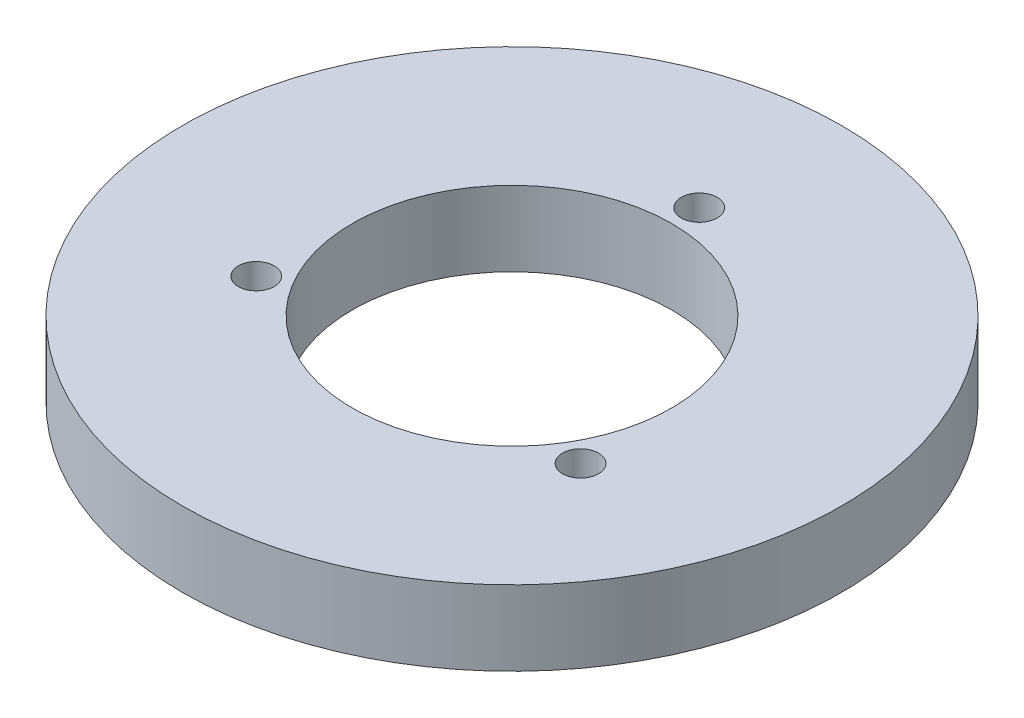
ISO-10303-21;
HEADER;
FILE_DESCRIPTION(('STEP AP214'),'2;1');
FILE_NAME('part.step','',(''),(''),'','','');
FILE_SCHEMA(('AUTOMOTIVE_DESIGN { 1 0 10303 214 1 1 1 1 }'));
ENDSEC;
DATA;
#1=APPLICATION_CONTEXT('core data for automotive mechanical design processes');
#2=APPLICATION_PROTOCOL_DEFINITION('international standard','automotive_design',2000,#1);
#3=PRODUCT_CONTEXT('',#1,'mechanical');
#4=PRODUCT('Part','Part','',(#3));
#5=PRODUCT_RELATED_PRODUCT_CATEGORY('part','',(#4));
#6=PRODUCT_DEFINITION_FORMATION('','',#4);
#7=PRODUCT_DEFINITION_CONTEXT('part definition',#1,'design');
#8=PRODUCT_DEFINITION('design','',#6,#7);
#9=PRODUCT_DEFINITION_SHAPE('','',#8);
#10=(LENGTH_UNIT() NAMED_UNIT(*) SI_UNIT(.MILLI.,.METRE.));
#11=(NAMED_UNIT(*) PLANE_ANGLE_UNIT() SI_UNIT($,.RADIAN.));
#12=(NAMED_UNIT(*) SI_UNIT($,.STERADIAN.) SOLID_ANGLE_UNIT());
#13=UNCERTAINTY_MEASURE_WITH_UNIT(LENGTH_MEASURE(1.E-05),#10,'distance_accuracy_value','');
#14=(GEOMETRIC_REPRESENTATION_CONTEXT(3) GLOBAL_UNCERTAINTY_ASSIGNED_CONTEXT((#13)) GLOBAL_UNIT_ASSIGNED_CONTEXT((#10,
#11,#12)) REPRESENTATION_CONTEXT('',''));
#15=CARTESIAN_POINT('',(0.,0.,0.));
#16=DIRECTION('',(0.,0.,1.));
#17=DIRECTION('',(1.,0.,0.));
#18=AXIS2_PLACEMENT_3D('',#15,#16,#17);
#19=CARTESIAN_POINT('',(0.,9.525,0.));
#20=DIRECTION('',(0.,1.,0.));
#21=DIRECTION('',(0.,0.,1.));
#22=AXIS2_PLACEMENT_3D('',#19,#20,#21);
#23=PLANE('',#22);
#24=CARTESIAN_POINT('',(0.,9.525,-23.8125));
#25=DIRECTION('',(0.,1.,0.));
#26=DIRECTION('',(0.,0.,1.));
#27=AXIS2_PLACEMENT_3D('',#24,#25,#26);
#28=CIRCLE('',#27,2.286);
#29=CARTESIAN_POINT('',(0.,9.525,-21.5265));
#30=VERTEX_POINT('',#29);
#31=EDGE_CURVE('E66',#30,#30,#28,.T.);
#32=ORIENTED_EDGE('',*,*,#31,.F.);
#33=EDGE_LOOP('',(#32));
#34=FACE_BOUND('',#33,.T.);
#35=CARTESIAN_POINT('',(20.6222299276185,9.525,11.9062499999991));
#36=DIRECTION('',(0.,1.,0.));
#37=DIRECTION('',(0.,0.,1.));
#38=AXIS2_PLACEMENT_3D('',#35,#36,#37);
#39=CIRCLE('',#38,2.286);
#40=CARTESIAN_POINT('',(20.6222299276185,9.525,14.1922499999991));
#41=VERTEX_POINT('',#40);
#42=EDGE_CURVE('E63',#41,#41,#39,.T.);
#43=ORIENTED_EDGE('',*,*,#42,.F.);
#44=EDGE_LOOP('',(#43));
#45=FACE_BOUND('',#44,.T.);
#46=CARTESIAN_POINT('',(-20.6222299276154,9.525,11.9062500000009));
#47=DIRECTION('',(0.,1.,0.));
#48=DIRECTION('',(0.,0.,1.));
#49=AXIS2_PLACEMENT_3D('',#46,#47,#48);
#50=CIRCLE('',#49,2.286);
#51=CARTESIAN_POINT('',(-20.6222299276154,9.525,14.1922500000009));
#52=VERTEX_POINT('',#51);
#53=EDGE_CURVE('E57',#52,#52,#50,.T.);
#54=ORIENTED_EDGE('',*,*,#53,.F.);
#55=EDGE_LOOP('',(#54));
#56=FACE_BOUND('',#55,.T.);
#57=CARTESIAN_POINT('',(0.,9.525,0.));
#58=DIRECTION('',(0.,1.,0.));
#59=DIRECTION('',(0.,0.,1.));
#60=AXIS2_PLACEMENT_3D('',#57,#58,#59);
#61=CIRCLE('',#60,41.91);
#62=CARTESIAN_POINT('',(0.,9.525,-41.91));
#63=VERTEX_POINT('',#62);
#64=EDGE_CURVE('E10',#63,#63,#61,.T.);
#65=ORIENTED_EDGE('',*,*,#64,.T.);
#66=EDGE_LOOP('',(#65));
#67=FACE_BOUND('',#66,.T.);
#68=CARTESIAN_POINT('',(0.,9.525,0.));
#69=DIRECTION('',(0.,1.,0.));
#70=DIRECTION('',(0.,0.,1.));
#71=AXIS2_PLACEMENT_3D('',#68,#69,#70);
#72=CIRCLE('',#71,20.32);
#73=CARTESIAN_POINT('',(0.,9.525,-20.32));
#74=VERTEX_POINT('',#73);
#75=EDGE_CURVE('E46',#74,#74,#72,.T.);
#76=ORIENTED_EDGE('',*,*,#75,.F.);
#77=EDGE_LOOP('',(#76));
#78=FACE_BOUND('',#77,.T.);
#79=ADVANCED_FACE('F35',(#34,#45,#56,#67,#78),#23,.T.);
#80=CARTESIAN_POINT('',(0.,0.,0.));
#81=DIRECTION('',(0.,1.,0.));
#82=DIRECTION('',(0.,0.,1.));
#83=AXIS2_PLACEMENT_3D('',#80,#81,#82);
#84=PLANE('',#83);
#85=CARTESIAN_POINT('',(0.,0.,-23.8125));
#86=DIRECTION('',(0.,1.,0.));
#87=DIRECTION('',(0.,0.,1.));
#88=AXIS2_PLACEMENT_3D('',#85,#86,#87);
#89=CIRCLE('',#88,2.286);
#90=CARTESIAN_POINT('',(0.,0.,-21.5265));
#91=VERTEX_POINT('',#90);
#92=EDGE_CURVE('E51',#91,#91,#89,.T.);
#93=ORIENTED_EDGE('',*,*,#92,.T.);
#94=EDGE_LOOP('',(#93));
#95=FACE_BOUND('',#94,.T.);
#96=CARTESIAN_POINT('',(20.6222299276185,0.,11.9062499999991));
#97=DIRECTION('',(0.,1.,0.));
#98=DIRECTION('',(0.,0.,1.));
#99=AXIS2_PLACEMENT_3D('',#96,#97,#98);
#100=CIRCLE('',#99,2.286);
#101=CARTESIAN_POINT('',(20.6222299276185,0.,14.1922499999991));
#102=VERTEX_POINT('',#101);
#103=EDGE_CURVE('E60',#102,#102,#100,.T.);
#104=ORIENTED_EDGE('',*,*,#103,.T.);
#105=EDGE_LOOP('',(#104));
#106=FACE_BOUND('',#105,.T.);
#107=CARTESIAN_POINT('',(-20.6222299276154,0.,11.9062500000009));
#108=DIRECTION('',(0.,1.,0.));
#109=DIRECTION('',(0.,0.,1.));
#110=AXIS2_PLACEMENT_3D('',#107,#108,#109);
#111=CIRCLE('',#110,2.286);
#112=CARTESIAN_POINT('',(-20.6222299276154,0.,14.1922500000009));
#113=VERTEX_POINT('',#112);
#114=EDGE_CURVE('E54',#113,#113,#111,.T.);
#115=ORIENTED_EDGE('',*,*,#114,.T.);
#116=EDGE_LOOP('',(#115));
#117=FACE_BOUND('',#116,.T.);
#118=CARTESIAN_POINT('',(0.,0.,0.));
#119=DIRECTION('',(0.,1.,0.));
#120=DIRECTION('',(0.,0.,1.));
#121=AXIS2_PLACEMENT_3D('',#118,#119,#120);
#122=CIRCLE('',#121,41.91);
#123=CARTESIAN_POINT('',(0.,0.,-41.91));
#124=VERTEX_POINT('',#123);
#125=EDGE_CURVE('E39',#124,#124,#122,.T.);
#126=ORIENTED_EDGE('',*,*,#125,.F.);
#127=EDGE_LOOP('',(#126));
#128=FACE_BOUND('',#127,.T.);
#129=CARTESIAN_POINT('',(0.,0.,0.));
#130=DIRECTION('',(0.,1.,0.));
#131=DIRECTION('',(0.,0.,1.));
#132=AXIS2_PLACEMENT_3D('',#129,#130,#131);
#133=CIRCLE('',#132,20.32);
#134=CARTESIAN_POINT('',(0.,0.,-20.32));
#135=VERTEX_POINT('',#134);
#136=EDGE_CURVE('E48',#135,#135,#133,.T.);
#137=ORIENTED_EDGE('',*,*,#136,.T.);
#138=EDGE_LOOP('',(#137));
#139=FACE_BOUND('',#138,.T.);
#140=ADVANCED_FACE('F72',(#95,#106,#117,#128,#139),#84,.F.);
#141=CARTESIAN_POINT('',(0.,9.525,0.));
#142=DIRECTION('',(0.,-1.,0.));
#143=DIRECTION('',(0.,0.,-1.));
#144=AXIS2_PLACEMENT_3D('',#141,#142,#143);
#145=CYLINDRICAL_SURFACE('',#144,41.91);
#146=CARTESIAN_POINT('',(0.,9.525,-41.91));
#147=CARTESIAN_POINT('',(0.,9.42578125,-41.91));
#148=CARTESIAN_POINT('',(0.,9.3265625,-41.91));
#149=CARTESIAN_POINT('',(0.,9.128125,-41.91));
#150=CARTESIAN_POINT('',(0.,9.02890625,-41.91));
#151=CARTESIAN_POINT('',(0.,8.83046875,-41.91));
#152=CARTESIAN_POINT('',(0.,8.73125,-41.91));
#153=CARTESIAN_POINT('',(0.,8.5328125,-41.91));
#154=CARTESIAN_POINT('',(0.,8.43359375,-41.91));
#155=CARTESIAN_POINT('',(0.,8.23515625,-41.91));
#156=CARTESIAN_POINT('',(0.,8.1359375,-41.91));
#157=CARTESIAN_POINT('',(0.,7.9375,-41.91));
#158=CARTESIAN_POINT('',(0.,7.83828125,-41.91));
#159=CARTESIAN_POINT('',(0.,7.63984375,-41.91));
#160=CARTESIAN_POINT('',(0.,7.540625,-41.91));
#161=CARTESIAN_POINT('',(0.,7.3421875,-41.91));
#162=CARTESIAN_POINT('',(0.,7.24296875,-41.91));
#163=CARTESIAN_POINT('',(0.,7.04453125,-41.91));
#164=CARTESIAN_POINT('',(0.,6.9453125,-41.91));
#165=CARTESIAN_POINT('',(0.,6.746875,-41.91));
#166=CARTESIAN_POINT('',(0.,6.64765625,-41.91));
#167=CARTESIAN_POINT('',(0.,6.44921875,-41.91));
#168=CARTESIAN_POINT('',(0.,6.35,-41.91));
#169=CARTESIAN_POINT('',(0.,6.1515625,-41.91));
#170=CARTESIAN_POINT('',(0.,6.05234375,-41.91));
#171=CARTESIAN_POINT('',(0.,5.85390625,-41.91));
#172=CARTESIAN_POINT('',(0.,5.7546875,-41.91));
#173=CARTESIAN_POINT('',(0.,5.55625,-41.91));
#174=CARTESIAN_POINT('',(0.,5.45703125,-41.91));
#175=CARTESIAN_POINT('',(0.,5.25859375,-41.91));
#176=CARTESIAN_POINT('',(0.,5.159375,-41.91));
#177=CARTESIAN_POINT('',(0.,4.9609375,-41.91));
#178=CARTESIAN_POINT('',(0.,4.86171875,-41.91));
#179=CARTESIAN_POINT('',(0.,4.66328125,-41.91));
#180=CARTESIAN_POINT('',(0.,4.5640625,-41.91));
#181=CARTESIAN_POINT('',(0.,4.365625,-41.91));
#182=CARTESIAN_POINT('',(0.,4.26640625,-41.91));
#183=CARTESIAN_POINT('',(0.,4.06796875,-41.91));
#184=CARTESIAN_POINT('',(0.,3.96875,-41.91));
#185=CARTESIAN_POINT('',(0.,3.7703125,-41.91));
#186=CARTESIAN_POINT('',(0.,3.67109375,-41.91));
#187=CARTESIAN_POINT('',(0.,3.47265625,-41.91));
#188=CARTESIAN_POINT('',(0.,3.3734375,-41.91));
#189=CARTESIAN_POINT('',(0.,3.175,-41.91));
#190=CARTESIAN_POINT('',(0.,3.07578125,-41.91));
#191=CARTESIAN_POINT('',(0.,2.87734375,-41.91));
#192=CARTESIAN_POINT('',(0.,2.778125,-41.91));
#193=CARTESIAN_POINT('',(0.,2.5796875,-41.91));
#194=CARTESIAN_POINT('',(0.,2.48046875,-41.91));
#195=CARTESIAN_POINT('',(0.,2.28203125,-41.91));
#196=CARTESIAN_POINT('',(0.,2.1828125,-41.91));
#197=CARTESIAN_POINT('',(0.,1.984375,-41.91));
#198=CARTESIAN_POINT('',(0.,1.88515625,-41.91));
#199=CARTESIAN_POINT('',(0.,1.68671875,-41.91));
#200=CARTESIAN_POINT('',(0.,1.5875,-41.91));
#201=CARTESIAN_POINT('',(0.,1.3890625,-41.91));
#202=CARTESIAN_POINT('',(0.,1.28984375,-41.91));
#203=CARTESIAN_POINT('',(0.,1.09140625,-41.91));
#204=CARTESIAN_POINT('',(0.,0.992187500000001,-41.91));
#205=CARTESIAN_POINT('',(0.,0.793750000000001,-41.91));
#206=CARTESIAN_POINT('',(0.,0.69453125,-41.91));
#207=CARTESIAN_POINT('',(0.,0.49609375,-41.91));
#208=CARTESIAN_POINT('',(0.,0.396875,-41.91));
#209=CARTESIAN_POINT('',(0.,0.1984375,-41.91));
#210=CARTESIAN_POINT('',(0.,0.0992187500000001,-41.91));
#211=CARTESIAN_POINT('',(0.,0.,-41.91));
#212=B_SPLINE_CURVE_WITH_KNOTS('',3,(#146,#147,#148,#149,#150,#151,#152,#153,#154,#155,#156,
#157,#158,#159,#160,#161,#162,#163,#164,#165,#166,#167,#168,#169,#170,#171,#172,#173,#174,#175,
#176,#177,#178,#179,#180,#181,#182,#183,#184,#185,#186,#187,#188,#189,#190,#191,#192,#193,#194,
#195,#196,#197,#198,#199,#200,#201,#202,#203,#204,#205,#206,#207,#208,#209,#210,#211),
.UNSPECIFIED.,.F.,.F.,(4,2,2,2,2,2,2,2,2,2,2,2,2,2,2,2,2,2,2,2,2,2,2,2,2,2,2,2,2,2,2,2,4),(0.,
0.29765625,0.5953125,0.892968750000001,1.190625,1.48828125,1.7859375,2.08359375,2.38125,
2.67890625,2.9765625,3.27421875,3.571875,3.86953125,4.1671875,4.46484375,4.7625,5.06015625,
5.3578125,5.65546875,5.953125,6.25078125,6.5484375,6.84609375,7.14375,7.44140625,7.7390625,
8.03671875,8.334375,8.63203125,8.9296875,9.22734375,9.525),.UNSPECIFIED.);
#213=EDGE_CURVE('BSEAM37',#63,#124,#212,.T.);
#214=ORIENTED_EDGE('',*,*,#64,.F.);
#215=ORIENTED_EDGE('',*,*,#125,.T.);
#216=ORIENTED_EDGE('',*,*,#213,.T.);
#217=ORIENTED_EDGE('',*,*,#213,.F.);
#218=EDGE_LOOP('',(#214,#216,#215,#217));
#219=FACE_BOUND('',#218,.T.);
#220=ADVANCED_FACE('F37',(#219),#145,.T.);
#221=CARTESIAN_POINT('',(0.,9.525,0.));
#222=DIRECTION('',(0.,-1.,0.));
#223=DIRECTION('',(0.,0.,-1.));
#224=AXIS2_PLACEMENT_3D('',#221,#222,#223);
#225=CYLINDRICAL_SURFACE('',#224,20.32);
#226=CARTESIAN_POINT('',(0.,9.525,-20.32));
#227=CARTESIAN_POINT('',(0.,9.42578125,-20.32));
#228=CARTESIAN_POINT('',(0.,9.3265625,-20.32));
#229=CARTESIAN_POINT('',(0.,9.128125,-20.32));
#230=CARTESIAN_POINT('',(0.,9.02890625,-20.32));
#231=CARTESIAN_POINT('',(0.,8.83046875,-20.32));
#232=CARTESIAN_POINT('',(0.,8.73125,-20.32));
#233=CARTESIAN_POINT('',(0.,8.5328125,-20.32));
#234=CARTESIAN_POINT('',(0.,8.43359375,-20.32));
#235=CARTESIAN_POINT('',(0.,8.23515625,-20.32));
#236=CARTESIAN_POINT('',(0.,8.1359375,-20.32));
#237=CARTESIAN_POINT('',(0.,7.9375,-20.32));
#238=CARTESIAN_POINT('',(0.,7.83828125,-20.32));
#239=CARTESIAN_POINT('',(0.,7.63984375,-20.32));
#240=CARTESIAN_POINT('',(0.,7.540625,-20.32));
#241=CARTESIAN_POINT('',(0.,7.3421875,-20.32));
#242=CARTESIAN_POINT('',(0.,7.24296875,-20.32));
#243=CARTESIAN_POINT('',(0.,7.04453125,-20.32));
#244=CARTESIAN_POINT('',(0.,6.9453125,-20.32));
#245=CARTESIAN_POINT('',(0.,6.746875,-20.32));
#246=CARTESIAN_POINT('',(0.,6.64765625,-20.32));
#247=CARTESIAN_POINT('',(0.,6.44921875,-20.32));
#248=CARTESIAN_POINT('',(0.,6.35,-20.32));
#249=CARTESIAN_POINT('',(0.,6.1515625,-20.32));
#250=CARTESIAN_POINT('',(0.,6.05234375,-20.32));
#251=CARTESIAN_POINT('',(0.,5.85390625,-20.32));
#252=CARTESIAN_POINT('',(0.,5.7546875,-20.32));
#253=CARTESIAN_POINT('',(0.,5.55625,-20.32));
#254=CARTESIAN_POINT('',(0.,5.45703125,-20.32));
#255=CARTESIAN_POINT('',(0.,5.25859375,-20.32));
#256=CARTESIAN_POINT('',(0.,5.159375,-20.32));
#257=CARTESIAN_POINT('',(0.,4.9609375,-20.32));
#258=CARTESIAN_POINT('',(0.,4.86171875,-20.32));
#259=CARTESIAN_POINT('',(0.,4.66328125,-20.32));
#260=CARTESIAN_POINT('',(0.,4.5640625,-20.32));
#261=CARTESIAN_POINT('',(0.,4.365625,-20.32));
#262=CARTESIAN_POINT('',(0.,4.26640625,-20.32));
#263=CARTESIAN_POINT('',(0.,4.06796875,-20.32));
#264=CARTESIAN_POINT('',(0.,3.96875,-20.32));
#265=CARTESIAN_POINT('',(0.,3.7703125,-20.32));
#266=CARTESIAN_POINT('',(0.,3.67109375,-20.32));
#267=CARTESIAN_POINT('',(0.,3.47265625,-20.32));
#268=CARTESIAN_POINT('',(0.,3.3734375,-20.32));
#269=CARTESIAN_POINT('',(0.,3.175,-20.32));
#270=CARTESIAN_POINT('',(0.,3.07578125,-20.32));
#271=CARTESIAN_POINT('',(0.,2.87734375,-20.32));
#272=CARTESIAN_POINT('',(0.,2.778125,-20.32));
#273=CARTESIAN_POINT('',(0.,2.5796875,-20.32));
#274=CARTESIAN_POINT('',(0.,2.48046875,-20.32));
#275=CARTESIAN_POINT('',(0.,2.28203125,-20.32));
#276=CARTESIAN_POINT('',(0.,2.1828125,-20.32));
#277=CARTESIAN_POINT('',(0.,1.984375,-20.32));
#278=CARTESIAN_POINT('',(0.,1.88515625,-20.32));
#279=CARTESIAN_POINT('',(0.,1.68671875,-20.32));
#280=CARTESIAN_POINT('',(0.,1.5875,-20.32));
#281=CARTESIAN_POINT('',(0.,1.3890625,-20.32));
#282=CARTESIAN_POINT('',(0.,1.28984375,-20.32));
#283=CARTESIAN_POINT('',(0.,1.09140625,-20.32));
#284=CARTESIAN_POINT('',(0.,0.992187500000001,-20.32));
#285=CARTESIAN_POINT('',(0.,0.793750000000001,-20.32));
#286=CARTESIAN_POINT('',(0.,0.69453125,-20.32));
#287=CARTESIAN_POINT('',(0.,0.49609375,-20.32));
#288=CARTESIAN_POINT('',(0.,0.396875,-20.32));
#289=CARTESIAN_POINT('',(0.,0.1984375,-20.32));
#290=CARTESIAN_POINT('',(0.,0.0992187500000001,-20.32));
#291=CARTESIAN_POINT('',(0.,0.,-20.32));
#292=B_SPLINE_CURVE_WITH_KNOTS('',3,(#226,#227,#228,#229,#230,#231,#232,#233,#234,#235,#236,
#237,#238,#239,#240,#241,#242,#243,#244,#245,#246,#247,#248,#249,#250,#251,#252,#253,#254,#255,
#256,#257,#258,#259,#260,#261,#262,#263,#264,#265,#266,#267,#268,#269,#270,#271,#272,#273,#274,
#275,#276,#277,#278,#279,#280,#281,#282,#283,#284,#285,#286,#287,#288,#289,#290,#291),
.UNSPECIFIED.,.F.,.F.,(4,2,2,2,2,2,2,2,2,2,2,2,2,2,2,2,2,2,2,2,2,2,2,2,2,2,2,2,2,2,2,2,4),(0.,
0.297656249999998,0.595312499999999,0.892968749999999,1.190625,1.48828125,1.7859375,2.08359375,
2.38125,2.67890625,2.9765625,3.27421875,3.571875,3.86953125,4.1671875,4.46484375,4.7625,
5.06015625,5.3578125,5.65546875,5.953125,6.25078125,6.5484375,6.84609375,7.14375,7.44140625,
7.7390625,8.03671875,8.334375,8.63203125,8.9296875,9.22734375,9.525),.UNSPECIFIED.);
#293=EDGE_CURVE('BSEAM91',#74,#135,#292,.T.);
#294=ORIENTED_EDGE('',*,*,#75,.T.);
#295=ORIENTED_EDGE('',*,*,#136,.F.);
#296=ORIENTED_EDGE('',*,*,#293,.T.);
#297=ORIENTED_EDGE('',*,*,#293,.F.);
#298=EDGE_LOOP('',(#294,#296,#295,#297));
#299=FACE_BOUND('',#298,.T.);
#300=ADVANCED_FACE('F91',(#299),#225,.F.);
#301=CARTESIAN_POINT('',(-20.6222299276154,0.,11.9062500000009));
#302=DIRECTION('',(0.,1.,0.));
#303=DIRECTION('',(0.,0.,1.));
#304=AXIS2_PLACEMENT_3D('',#301,#302,#303);
#305=CYLINDRICAL_SURFACE('',#304,2.286);
#306=CARTESIAN_POINT('',(-20.6222299276154,0.,14.1922500000009));
#307=CARTESIAN_POINT('',(-20.6222299276154,0.0992187499999999,14.1922500000009));
#308=CARTESIAN_POINT('',(-20.6222299276154,0.1984375,14.1922500000009));
#309=CARTESIAN_POINT('',(-20.6222299276154,0.396875,14.1922500000009));
#310=CARTESIAN_POINT('',(-20.6222299276154,0.49609375,14.1922500000009));
#311=CARTESIAN_POINT('',(-20.6222299276154,0.69453125,14.1922500000009));
#312=CARTESIAN_POINT('',(-20.6222299276154,0.79375,14.1922500000009));
#313=CARTESIAN_POINT('',(-20.6222299276154,0.9921875,14.1922500000009));
#314=CARTESIAN_POINT('',(-20.6222299276154,1.09140625,14.1922500000009));
#315=CARTESIAN_POINT('',(-20.6222299276154,1.28984375,14.1922500000009));
#316=CARTESIAN_POINT('',(-20.6222299276154,1.3890625,14.1922500000009));
#317=CARTESIAN_POINT('',(-20.6222299276154,1.5875,14.1922500000009));
#318=CARTESIAN_POINT('',(-20.6222299276154,1.68671875,14.1922500000009));
#319=CARTESIAN_POINT('',(-20.6222299276154,1.88515625,14.1922500000009));
#320=CARTESIAN_POINT('',(-20.6222299276154,1.984375,14.1922500000009));
#321=CARTESIAN_POINT('',(-20.6222299276154,2.1828125,14.1922500000009));
#322=CARTESIAN_POINT('',(-20.6222299276154,2.28203125,14.1922500000009));
#323=CARTESIAN_POINT('',(-20.6222299276154,2.48046875,14.1922500000009));
#324=CARTESIAN_POINT('',(-20.6222299276154,2.5796875,14.1922500000009));
#325=CARTESIAN_POINT('',(-20.6222299276154,2.778125,14.1922500000009));
#326=CARTESIAN_POINT('',(-20.6222299276154,2.87734375,14.1922500000009));
#327=CARTESIAN_POINT('',(-20.6222299276154,3.07578125,14.1922500000009));
#328=CARTESIAN_POINT('',(-20.6222299276154,3.175,14.1922500000009));
#329=CARTESIAN_POINT('',(-20.6222299276154,3.3734375,14.1922500000009));
#330=CARTESIAN_POINT('',(-20.6222299276154,3.47265625,14.1922500000009));
#331=CARTESIAN_POINT('',(-20.6222299276154,3.67109375,14.1922500000009));
#332=CARTESIAN_POINT('',(-20.6222299276154,3.7703125,14.1922500000009));
#333=CARTESIAN_POINT('',(-20.6222299276154,3.96875,14.1922500000009));
#334=CARTESIAN_POINT('',(-20.6222299276154,4.06796875,14.1922500000009));
#335=CARTESIAN_POINT('',(-20.6222299276154,4.26640625,14.1922500000009));
#336=CARTESIAN_POINT('',(-20.6222299276154,4.365625,14.1922500000009));
#337=CARTESIAN_POINT('',(-20.6222299276154,4.5640625,14.1922500000009));
#338=CARTESIAN_POINT('',(-20.6222299276154,4.66328125,14.1922500000009));
#339=CARTESIAN_POINT('',(-20.6222299276154,4.86171875,14.1922500000009));
#340=CARTESIAN_POINT('',(-20.6222299276154,4.9609375,14.1922500000009));
#341=CARTESIAN_POINT('',(-20.6222299276154,5.159375,14.1922500000009));
#342=CARTESIAN_POINT('',(-20.6222299276154,5.25859375,14.1922500000009));
#343=CARTESIAN_POINT('',(-20.6222299276154,5.45703125,14.1922500000009));
#344=CARTESIAN_POINT('',(-20.6222299276154,5.55625,14.1922500000009));
#345=CARTESIAN_POINT('',(-20.6222299276154,5.7546875,14.1922500000009));
#346=CARTESIAN_POINT('',(-20.6222299276154,5.85390625,14.1922500000009));
#347=CARTESIAN_POINT('',(-20.6222299276154,6.05234375,14.1922500000009));
#348=CARTESIAN_POINT('',(-20.6222299276154,6.1515625,14.1922500000009));
#349=CARTESIAN_POINT('',(-20.6222299276154,6.35,14.1922500000009));
#350=CARTESIAN_POINT('',(-20.6222299276154,6.44921875,14.1922500000009));
#351=CARTESIAN_POINT('',(-20.6222299276154,6.64765625,14.1922500000009));
#352=CARTESIAN_POINT('',(-20.6222299276154,6.746875,14.1922500000009));
#353=CARTESIAN_POINT('',(-20.6222299276154,6.9453125,14.1922500000009));
#354=CARTESIAN_POINT('',(-20.6222299276154,7.04453125,14.1922500000009));
#355=CARTESIAN_POINT('',(-20.6222299276154,7.24296875,14.1922500000009));
#356=CARTESIAN_POINT('',(-20.6222299276154,7.3421875,14.1922500000009));
#357=CARTESIAN_POINT('',(-20.6222299276154,7.540625,14.1922500000009));
#358=CARTESIAN_POINT('',(-20.6222299276154,7.63984375,14.1922500000009));
#359=CARTESIAN_POINT('',(-20.6222299276154,7.83828125,14.1922500000009));
#360=CARTESIAN_POINT('',(-20.6222299276154,7.9375,14.1922500000009));
#361=CARTESIAN_POINT('',(-20.6222299276154,8.1359375,14.1922500000009));
#362=CARTESIAN_POINT('',(-20.6222299276154,8.23515625,14.1922500000009));
#363=CARTESIAN_POINT('',(-20.6222299276154,8.43359375,14.1922500000009));
#364=CARTESIAN_POINT('',(-20.6222299276154,8.5328125,14.1922500000009));
#365=CARTESIAN_POINT('',(-20.6222299276154,8.73125,14.1922500000009));
#366=CARTESIAN_POINT('',(-20.6222299276154,8.83046875,14.1922500000009));
#367=CARTESIAN_POINT('',(-20.6222299276154,9.02890625,14.1922500000009));
#368=CARTESIAN_POINT('',(-20.6222299276154,9.128125,14.1922500000009));
#369=CARTESIAN_POINT('',(-20.6222299276154,9.3265625,14.1922500000009));
#370=CARTESIAN_POINT('',(-20.6222299276154,9.42578125,14.1922500000009));
#371=CARTESIAN_POINT('',(-20.6222299276154,9.525,14.1922500000009));
#372=B_SPLINE_CURVE_WITH_KNOTS('',3,(#306,#307,#308,#309,#310,#311,#312,#313,#314,#315,#316,
#317,#318,#319,#320,#321,#322,#323,#324,#325,#326,#327,#328,#329,#330,#331,#332,#333,#334,#335,
#336,#337,#338,#339,#340,#341,#342,#343,#344,#345,#346,#347,#348,#349,#350,#351,#352,#353,#354,
#355,#356,#357,#358,#359,#360,#361,#362,#363,#364,#365,#366,#367,#368,#369,#370,#371),
.UNSPECIFIED.,.F.,.F.,(4,2,2,2,2,2,2,2,2,2,2,2,2,2,2,2,2,2,2,2,2,2,2,2,2,2,2,2,2,2,2,2,4),(0.,
0.29765625,0.5953125,0.89296875,1.190625,1.48828125,1.7859375,2.08359375,2.38125,2.67890625,
2.9765625,3.27421875,3.571875,3.86953125,4.1671875,4.46484375,4.7625,5.06015625,5.3578125,
5.65546875,5.953125,6.25078125,6.5484375,6.84609375,7.14375,7.44140625,7.7390625,8.03671875,
8.334375,8.63203125,8.9296875,9.22734375,9.525),.UNSPECIFIED.);
#373=EDGE_CURVE('BSEAM94',#113,#52,#372,.T.);
#374=ORIENTED_EDGE('',*,*,#114,.F.);
#375=ORIENTED_EDGE('',*,*,#53,.T.);
#376=ORIENTED_EDGE('',*,*,#373,.T.);
#377=ORIENTED_EDGE('',*,*,#373,.F.);
#378=EDGE_LOOP('',(#374,#376,#375,#377));
#379=FACE_BOUND('',#378,.T.);
#380=ADVANCED_FACE('F94',(#379),#305,.F.);
#381=CARTESIAN_POINT('',(20.6222299276185,0.,11.9062499999991));
#382=DIRECTION('',(0.,1.,0.));
#383=DIRECTION('',(0.,0.,1.));
#384=AXIS2_PLACEMENT_3D('',#381,#382,#383);
#385=CYLINDRICAL_SURFACE('',#384,2.286);
#386=CARTESIAN_POINT('',(20.6222299276185,0.,14.1922499999991));
#387=CARTESIAN_POINT('',(20.6222299276185,0.0992187499999999,14.1922499999991));
#388=CARTESIAN_POINT('',(20.6222299276185,0.1984375,14.1922499999991));
#389=CARTESIAN_POINT('',(20.6222299276185,0.396875,14.1922499999991));
#390=CARTESIAN_POINT('',(20.6222299276185,0.49609375,14.1922499999991));
#391=CARTESIAN_POINT('',(20.6222299276185,0.69453125,14.1922499999991));
#392=CARTESIAN_POINT('',(20.6222299276185,0.79375,14.1922499999991));
#393=CARTESIAN_POINT('',(20.6222299276185,0.9921875,14.1922499999991));
#394=CARTESIAN_POINT('',(20.6222299276185,1.09140625,14.1922499999991));
#395=CARTESIAN_POINT('',(20.6222299276185,1.28984375,14.1922499999991));
#396=CARTESIAN_POINT('',(20.6222299276185,1.3890625,14.1922499999991));
#397=CARTESIAN_POINT('',(20.6222299276185,1.5875,14.1922499999991));
#398=CARTESIAN_POINT('',(20.6222299276185,1.68671875,14.1922499999991));
#399=CARTESIAN_POINT('',(20.6222299276185,1.88515625,14.1922499999991));
#400=CARTESIAN_POINT('',(20.6222299276185,1.984375,14.1922499999991));
#401=CARTESIAN_POINT('',(20.6222299276185,2.1828125,14.1922499999991));
#402=CARTESIAN_POINT('',(20.6222299276185,2.28203125,14.1922499999991));
#403=CARTESIAN_POINT('',(20.6222299276185,2.48046875,14.1922499999991));
#404=CARTESIAN_POINT('',(20.6222299276185,2.5796875,14.1922499999991));
#405=CARTESIAN_POINT('',(20.6222299276185,2.778125,14.1922499999991));
#406=CARTESIAN_POINT('',(20.6222299276185,2.87734375,14.1922499999991));
#407=CARTESIAN_POINT('',(20.6222299276185,3.07578125,14.1922499999991));
#408=CARTESIAN_POINT('',(20.6222299276185,3.175,14.1922499999991));
#409=CARTESIAN_POINT('',(20.6222299276185,3.3734375,14.1922499999991));
#410=CARTESIAN_POINT('',(20.6222299276185,3.47265625,14.1922499999991));
#411=CARTESIAN_POINT('',(20.6222299276185,3.67109375,14.1922499999991));
#412=CARTESIAN_POINT('',(20.6222299276185,3.7703125,14.1922499999991));
#413=CARTESIAN_POINT('',(20.6222299276185,3.96875,14.1922499999991));
#414=CARTESIAN_POINT('',(20.6222299276185,4.06796875,14.1922499999991));
#415=CARTESIAN_POINT('',(20.6222299276185,4.26640625,14.1922499999991));
#416=CARTESIAN_POINT('',(20.6222299276185,4.365625,14.1922499999991));
#417=CARTESIAN_POINT('',(20.6222299276185,4.5640625,14.1922499999991));
#418=CARTESIAN_POINT('',(20.6222299276185,4.66328125,14.1922499999991));
#419=CARTESIAN_POINT('',(20.6222299276185,4.86171875,14.1922499999991));
#420=CARTESIAN_POINT('',(20.6222299276185,4.9609375,14.1922499999991));
#421=CARTESIAN_POINT('',(20.6222299276185,5.159375,14.1922499999991));
#422=CARTESIAN_POINT('',(20.6222299276185,5.25859375,14.1922499999991));
#423=CARTESIAN_POINT('',(20.6222299276185,5.45703125,14.1922499999991));
#424=CARTESIAN_POINT('',(20.6222299276185,5.55625,14.1922499999991));
#425=CARTESIAN_POINT('',(20.6222299276185,5.7546875,14.1922499999991));
#426=CARTESIAN_POINT('',(20.6222299276185,5.85390625,14.1922499999991));
#427=CARTESIAN_POINT('',(20.6222299276185,6.05234375,14.1922499999991));
#428=CARTESIAN_POINT('',(20.6222299276185,6.1515625,14.1922499999991));
#429=CARTESIAN_POINT('',(20.6222299276185,6.35,14.1922499999991));
#430=CARTESIAN_POINT('',(20.6222299276185,6.44921875,14.1922499999991));
#431=CARTESIAN_POINT('',(20.6222299276185,6.64765625,14.1922499999991));
#432=CARTESIAN_POINT('',(20.6222299276185,6.746875,14.1922499999991));
#433=CARTESIAN_POINT('',(20.6222299276185,6.9453125,14.1922499999991));
#434=CARTESIAN_POINT('',(20.6222299276185,7.04453125,14.1922499999991));
#435=CARTESIAN_POINT('',(20.6222299276185,7.24296875,14.1922499999991));
#436=CARTESIAN_POINT('',(20.6222299276185,7.3421875,14.1922499999991));
#437=CARTESIAN_POINT('',(20.6222299276185,7.540625,14.1922499999991));
#438=CARTESIAN_POINT('',(20.6222299276185,7.63984375,14.1922499999991));
#439=CARTESIAN_POINT('',(20.6222299276185,7.83828125,14.1922499999991));
#440=CARTESIAN_POINT('',(20.6222299276185,7.9375,14.1922499999991));
#441=CARTESIAN_POINT('',(20.6222299276185,8.1359375,14.1922499999991));
#442=CARTESIAN_POINT('',(20.6222299276185,8.23515625,14.1922499999991));
#443=CARTESIAN_POINT('',(20.6222299276185,8.43359375,14.1922499999991));
#444=CARTESIAN_POINT('',(20.6222299276185,8.5328125,14.1922499999991));
#445=CARTESIAN_POINT('',(20.6222299276185,8.73125,14.1922499999991));
#446=CARTESIAN_POINT('',(20.6222299276185,8.83046875,14.1922499999991));
#447=CARTESIAN_POINT('',(20.6222299276185,9.02890625,14.1922499999991));
#448=CARTESIAN_POINT('',(20.6222299276185,9.128125,14.1922499999991));
#449=CARTESIAN_POINT('',(20.6222299276185,9.3265625,14.1922499999991));
#450=CARTESIAN_POINT('',(20.6222299276185,9.42578125,14.1922499999991));
#451=CARTESIAN_POINT('',(20.6222299276185,9.525,14.1922499999991));
#452=B_SPLINE_CURVE_WITH_KNOTS('',3,(#386,#387,#388,#389,#390,#391,#392,#393,#394,#395,#396,
#397,#398,#399,#400,#401,#402,#403,#404,#405,#406,#407,#408,#409,#410,#411,#412,#413,#414,#415,
#416,#417,#418,#419,#420,#421,#422,#423,#424,#425,#426,#427,#428,#429,#430,#431,#432,#433,#434,
#435,#436,#437,#438,#439,#440,#441,#442,#443,#444,#445,#446,#447,#448,#449,#450,#451),
.UNSPECIFIED.,.F.,.F.,(4,2,2,2,2,2,2,2,2,2,2,2,2,2,2,2,2,2,2,2,2,2,2,2,2,2,2,2,2,2,2,2,4),(0.,
0.29765625,0.5953125,0.89296875,1.190625,1.48828125,1.7859375,2.08359375,2.38125,2.67890625,
2.9765625,3.27421875,3.571875,3.86953125,4.1671875,4.46484375,4.7625,5.06015625,5.3578125,
5.65546875,5.953125,6.25078125,6.5484375,6.84609375,7.14375,7.44140625,7.7390625,8.03671875,
8.334375,8.63203125,8.9296875,9.22734375,9.525),.UNSPECIFIED.);
#453=EDGE_CURVE('BSEAM78',#102,#41,#452,.T.);
#454=ORIENTED_EDGE('',*,*,#103,.F.);
#455=ORIENTED_EDGE('',*,*,#42,.T.);
#456=ORIENTED_EDGE('',*,*,#453,.T.);
#457=ORIENTED_EDGE('',*,*,#453,.F.);
#458=EDGE_LOOP('',(#454,#456,#455,#457));
#459=FACE_BOUND('',#458,.T.);
#460=ADVANCED_FACE('F78',(#459),#385,.F.);
#461=CARTESIAN_POINT('',(0.,0.,-23.8125));
#462=DIRECTION('',(0.,1.,0.));
#463=DIRECTION('',(0.,0.,1.));
#464=AXIS2_PLACEMENT_3D('',#461,#462,#463);
#465=CYLINDRICAL_SURFACE('',#464,2.286);
#466=CARTESIAN_POINT('',(0.,0.,-21.5265));
#467=CARTESIAN_POINT('',(0.,0.0992187499999999,-21.5265));
#468=CARTESIAN_POINT('',(0.,0.1984375,-21.5265));
#469=CARTESIAN_POINT('',(0.,0.396875,-21.5265));
#470=CARTESIAN_POINT('',(0.,0.49609375,-21.5265));
#471=CARTESIAN_POINT('',(0.,0.69453125,-21.5265));
#472=CARTESIAN_POINT('',(0.,0.79375,-21.5265));
#473=CARTESIAN_POINT('',(0.,0.9921875,-21.5265));
#474=CARTESIAN_POINT('',(0.,1.09140625,-21.5265));
#475=CARTESIAN_POINT('',(0.,1.28984375,-21.5265));
#476=CARTESIAN_POINT('',(0.,1.3890625,-21.5265));
#477=CARTESIAN_POINT('',(0.,1.5875,-21.5265));
#478=CARTESIAN_POINT('',(0.,1.68671875,-21.5265));
#479=CARTESIAN_POINT('',(0.,1.88515625,-21.5265));
#480=CARTESIAN_POINT('',(0.,1.984375,-21.5265));
#481=CARTESIAN_POINT('',(0.,2.1828125,-21.5265));
#482=CARTESIAN_POINT('',(0.,2.28203125,-21.5265));
#483=CARTESIAN_POINT('',(0.,2.48046875,-21.5265));
#484=CARTESIAN_POINT('',(0.,2.5796875,-21.5265));
#485=CARTESIAN_POINT('',(0.,2.778125,-21.5265));
#486=CARTESIAN_POINT('',(0.,2.87734375,-21.5265));
#487=CARTESIAN_POINT('',(0.,3.07578125,-21.5265));
#488=CARTESIAN_POINT('',(0.,3.175,-21.5265));
#489=CARTESIAN_POINT('',(0.,3.3734375,-21.5265));
#490=CARTESIAN_POINT('',(0.,3.47265625,-21.5265));
#491=CARTESIAN_POINT('',(0.,3.67109375,-21.5265));
#492=CARTESIAN_POINT('',(0.,3.7703125,-21.5265));
#493=CARTESIAN_POINT('',(0.,3.96875,-21.5265));
#494=CARTESIAN_POINT('',(0.,4.06796875,-21.5265));
#495=CARTESIAN_POINT('',(0.,4.26640625,-21.5265));
#496=CARTESIAN_POINT('',(0.,4.365625,-21.5265));
#497=CARTESIAN_POINT('',(0.,4.5640625,-21.5265));
#498=CARTESIAN_POINT('',(0.,4.66328125,-21.5265));
#499=CARTESIAN_POINT('',(0.,4.86171875,-21.5265));
#500=CARTESIAN_POINT('',(0.,4.9609375,-21.5265));
#501=CARTESIAN_POINT('',(0.,5.159375,-21.5265));
#502=CARTESIAN_POINT('',(0.,5.25859375,-21.5265));
#503=CARTESIAN_POINT('',(0.,5.45703125,-21.5265));
#504=CARTESIAN_POINT('',(0.,5.55625,-21.5265));
#505=CARTESIAN_POINT('',(0.,5.7546875,-21.5265));
#506=CARTESIAN_POINT('',(0.,5.85390625,-21.5265));
#507=CARTESIAN_POINT('',(0.,6.05234375,-21.5265));
#508=CARTESIAN_POINT('',(0.,6.1515625,-21.5265));
#509=CARTESIAN_POINT('',(0.,6.35,-21.5265));
#510=CARTESIAN_POINT('',(0.,6.44921875,-21.5265));
#511=CARTESIAN_POINT('',(0.,6.64765625,-21.5265));
#512=CARTESIAN_POINT('',(0.,6.746875,-21.5265));
#513=CARTESIAN_POINT('',(0.,6.9453125,-21.5265));
#514=CARTESIAN_POINT('',(0.,7.04453125,-21.5265));
#515=CARTESIAN_POINT('',(0.,7.24296875,-21.5265));
#516=CARTESIAN_POINT('',(0.,7.3421875,-21.5265));
#517=CARTESIAN_POINT('',(0.,7.540625,-21.5265));
#518=CARTESIAN_POINT('',(0.,7.63984375,-21.5265));
#519=CARTESIAN_POINT('',(0.,7.83828125,-21.5265));
#520=CARTESIAN_POINT('',(0.,7.9375,-21.5265));
#521=CARTESIAN_POINT('',(0.,8.1359375,-21.5265));
#522=CARTESIAN_POINT('',(0.,8.23515625,-21.5265));
#523=CARTESIAN_POINT('',(0.,8.43359375,-21.5265));
#524=CARTESIAN_POINT('',(0.,8.5328125,-21.5265));
#525=CARTESIAN_POINT('',(0.,8.73125,-21.5265));
#526=CARTESIAN_POINT('',(0.,8.83046875,-21.5265));
#527=CARTESIAN_POINT('',(0.,9.02890625,-21.5265));
#528=CARTESIAN_POINT('',(0.,9.128125,-21.5265));
#529=CARTESIAN_POINT('',(0.,9.3265625,-21.5265));
#530=CARTESIAN_POINT('',(0.,9.42578125,-21.5265));
#531=CARTESIAN_POINT('',(0.,9.525,-21.5265));
#532=B_SPLINE_CURVE_WITH_KNOTS('',3,(#466,#467,#468,#469,#470,#471,#472,#473,#474,#475,#476,
#477,#478,#479,#480,#481,#482,#483,#484,#485,#486,#487,#488,#489,#490,#491,#492,#493,#494,#495,
#496,#497,#498,#499,#500,#501,#502,#503,#504,#505,#506,#507,#508,#509,#510,#511,#512,#513,#514,
#515,#516,#517,#518,#519,#520,#521,#522,#523,#524,#525,#526,#527,#528,#529,#530,#531),
.UNSPECIFIED.,.F.,.F.,(4,2,2,2,2,2,2,2,2,2,2,2,2,2,2,2,2,2,2,2,2,2,2,2,2,2,2,2,2,2,2,2,4),(0.,
0.29765625,0.5953125,0.89296875,1.190625,1.48828125,1.7859375,2.08359375,2.38125,2.67890625,
2.9765625,3.27421875,3.571875,3.86953125,4.1671875,4.46484375,4.7625,5.06015625,5.3578125,
5.65546875,5.953125,6.25078125,6.5484375,6.84609375,7.14375,7.44140625,7.7390625,8.03671875,
8.334375,8.63203125,8.9296875,9.22734375,9.525),.UNSPECIFIED.);
#533=EDGE_CURVE('BSEAM75',#91,#30,#532,.T.);
#534=ORIENTED_EDGE('',*,*,#92,.F.);
#535=ORIENTED_EDGE('',*,*,#31,.T.);
#536=ORIENTED_EDGE('',*,*,#533,.T.);
#537=ORIENTED_EDGE('',*,*,#533,.F.);
#538=EDGE_LOOP('',(#534,#536,#535,#537));
#539=FACE_BOUND('',#538,.T.);
#540=ADVANCED_FACE('F75',(#539),#465,.F.);
#541=CLOSED_SHELL('',(#79,#140,#220,#300,#380,#460,#540));
#542=MANIFOLD_SOLID_BREP('B2',#541);
#543=ADVANCED_BREP_SHAPE_REPRESENTATION('',(#18,#542),#14);
#544=SHAPE_DEFINITION_REPRESENTATION(#9,#543);
ENDSEC;
END-ISO-10303-21;
